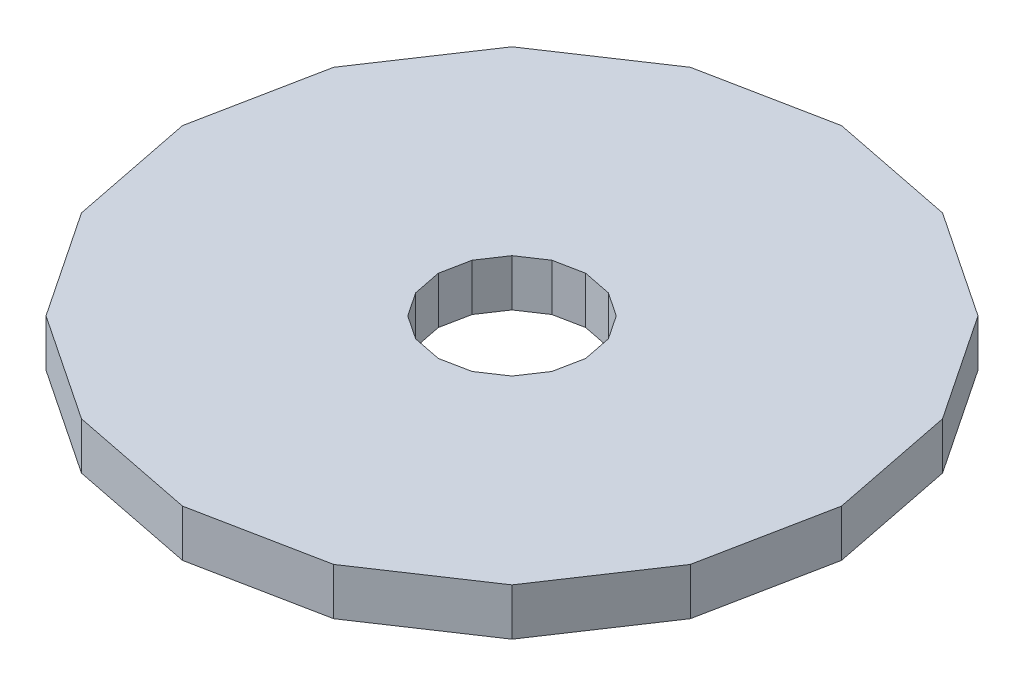
ISO-10303-21;
HEADER;
FILE_DESCRIPTION(('STEP AP214'),'2;1');
FILE_NAME('part.step','',(''),(''),'','','');
FILE_SCHEMA(('AUTOMOTIVE_DESIGN { 1 0 10303 214 1 1 1 1 }'));
ENDSEC;
DATA;
#1=APPLICATION_CONTEXT('core data for automotive mechanical design processes');
#2=APPLICATION_PROTOCOL_DEFINITION('international standard','automotive_design',2000,#1);
#3=PRODUCT_CONTEXT('',#1,'mechanical');
#4=PRODUCT('Part','Part','',(#3));
#5=PRODUCT_RELATED_PRODUCT_CATEGORY('part','',(#4));
#6=PRODUCT_DEFINITION_FORMATION('','',#4);
#7=PRODUCT_DEFINITION_CONTEXT('part definition',#1,'design');
#8=PRODUCT_DEFINITION('design','',#6,#7);
#9=PRODUCT_DEFINITION_SHAPE('','',#8);
#10=(LENGTH_UNIT() NAMED_UNIT(*) SI_UNIT(.MILLI.,.METRE.));
#11=(NAMED_UNIT(*) PLANE_ANGLE_UNIT() SI_UNIT($,.RADIAN.));
#12=(NAMED_UNIT(*) SI_UNIT($,.STERADIAN.) SOLID_ANGLE_UNIT());
#13=UNCERTAINTY_MEASURE_WITH_UNIT(LENGTH_MEASURE(1.E-05),#10,'distance_accuracy_value','');
#14=(GEOMETRIC_REPRESENTATION_CONTEXT(3) GLOBAL_UNCERTAINTY_ASSIGNED_CONTEXT((#13)) GLOBAL_UNIT_ASSIGNED_CONTEXT((#10,
#11,#12)) REPRESENTATION_CONTEXT('',''));
#15=CARTESIAN_POINT('',(0.,0.,0.));
#16=DIRECTION('',(0.,0.,1.));
#17=DIRECTION('',(1.,0.,0.));
#18=AXIS2_PLACEMENT_3D('',#15,#16,#17);
#19=CARTESIAN_POINT('',(0.,19.05,0.));
#20=DIRECTION('',(0.,1.,0.));
#21=DIRECTION('',(0.,0.,1.));
#22=AXIS2_PLACEMENT_3D('',#19,#20,#21);
#23=PLANE('',#22);
#24=DIRECTION('',(0.195090322016117,0.,-0.980785280403233));
#25=VECTOR('',#24,1.);
#26=CARTESIAN_POINT('',(123.292654296521,19.05,51.069489550595));
#27=LINE('',#26,#25);
#28=CARTESIAN_POINT('',(123.292654296521,19.05,51.069489550595));
#29=VERTEX_POINT('',#28);
#30=CARTESIAN_POINT('',(133.451007363901,19.05,-1.58553733568368E-12));
#31=VERTEX_POINT('',#30);
#32=EDGE_CURVE('E386',#29,#31,#27,.T.);
#33=ORIENTED_EDGE('',*,*,#32,.T.);
#34=DIRECTION('',(-0.19509032201614,0.,-0.980785280403228));
#35=VECTOR('',#34,1.);
#36=CARTESIAN_POINT('',(133.451007363901,19.05,-1.58553733568368E-12));
#37=LINE('',#36,#35);
#38=CARTESIAN_POINT('',(123.29265429652,19.05,-51.0694895505977));
#39=VERTEX_POINT('',#38);
#40=EDGE_CURVE('E390',#31,#39,#37,.T.);
#41=ORIENTED_EDGE('',*,*,#40,.T.);
#42=DIRECTION('',(-0.555570233019612,0.,-0.831469612302539));
#43=VECTOR('',#42,1.);
#44=CARTESIAN_POINT('',(123.29265429652,19.05,-51.0694895505977));
#45=LINE('',#44,#43);
#46=CARTESIAN_POINT('',(94.3641122631888,19.05,-94.3641122631911));
#47=VERTEX_POINT('',#46);
#48=EDGE_CURVE('E394',#39,#47,#45,.T.);
#49=ORIENTED_EDGE('',*,*,#48,.T.);
#50=DIRECTION('',(-0.831469612302552,0.,-0.555570233019593));
#51=VECTOR('',#50,1.);
#52=CARTESIAN_POINT('',(94.3641122631888,19.05,-94.3641122631911));
#53=LINE('',#52,#51);
#54=CARTESIAN_POINT('',(51.0694895505949,19.05,-123.292654296521));
#55=VERTEX_POINT('',#54);
#56=EDGE_CURVE('E396',#47,#55,#53,.T.);
#57=ORIENTED_EDGE('',*,*,#56,.T.);
#58=DIRECTION('',(-0.980785280403233,0.,-0.195090322016117));
#59=VECTOR('',#58,1.);
#60=CARTESIAN_POINT('',(51.0694895505949,19.05,-123.292654296521));
#61=LINE('',#60,#59);
#62=CARTESIAN_POINT('',(-1.58266796071834E-12,19.05,-133.451007363901));
#63=VERTEX_POINT('',#62);
#64=EDGE_CURVE('E399',#55,#63,#61,.T.);
#65=ORIENTED_EDGE('',*,*,#64,.T.);
#66=DIRECTION('',(-0.980785280403228,0.,0.195090322016139));
#67=VECTOR('',#66,1.);
#68=CARTESIAN_POINT('',(-1.58266796071834E-12,19.05,-133.451007363901));
#69=LINE('',#68,#67);
#70=CARTESIAN_POINT('',(-51.0694895505977,19.05,-123.29265429652));
#71=VERTEX_POINT('',#70);
#72=EDGE_CURVE('E401',#63,#71,#69,.T.);
#73=ORIENTED_EDGE('',*,*,#72,.T.);
#74=DIRECTION('',(-0.831469612302539,0.,0.555570233019612));
#75=VECTOR('',#74,1.);
#76=CARTESIAN_POINT('',(-51.0694895505977,19.05,-123.29265429652));
#77=LINE('',#76,#75);
#78=CARTESIAN_POINT('',(-94.364112263191,19.05,-94.3641122631889));
#79=VERTEX_POINT('',#78);
#80=EDGE_CURVE('E403',#71,#79,#77,.T.);
#81=ORIENTED_EDGE('',*,*,#80,.T.);
#82=DIRECTION('',(-0.555570233019593,0.,0.831469612302552));
#83=VECTOR('',#82,1.);
#84=CARTESIAN_POINT('',(-94.364112263191,19.05,-94.3641122631889));
#85=LINE('',#84,#83);
#86=CARTESIAN_POINT('',(-123.292654296521,19.05,-51.0694895505949));
#87=VERTEX_POINT('',#86);
#88=EDGE_CURVE('E405',#79,#87,#85,.T.);
#89=ORIENTED_EDGE('',*,*,#88,.T.);
#90=DIRECTION('',(-0.195090322016117,0.,0.980785280403233));
#91=VECTOR('',#90,1.);
#92=CARTESIAN_POINT('',(-123.292654296521,19.05,-51.0694895505949));
#93=LINE('',#92,#91);
#94=CARTESIAN_POINT('',(-133.451007363901,19.05,1.58263703031072E-12));
#95=VERTEX_POINT('',#94);
#96=EDGE_CURVE('E407',#87,#95,#93,.T.);
#97=ORIENTED_EDGE('',*,*,#96,.T.);
#98=DIRECTION('',(0.19509032201614,0.,0.980785280403228));
#99=VECTOR('',#98,1.);
#100=CARTESIAN_POINT('',(-133.451007363901,19.05,1.58263703031072E-12));
#101=LINE('',#100,#99);
#102=CARTESIAN_POINT('',(-123.29265429652,19.05,51.0694895505977));
#103=VERTEX_POINT('',#102);
#104=EDGE_CURVE('E410',#95,#103,#101,.T.);
#105=ORIENTED_EDGE('',*,*,#104,.T.);
#106=DIRECTION('',(0.555570233019612,0.,0.831469612302539));
#107=VECTOR('',#106,1.);
#108=CARTESIAN_POINT('',(-123.29265429652,19.05,51.0694895505977));
#109=LINE('',#108,#107);
#110=CARTESIAN_POINT('',(-94.3641122631889,19.05,94.3641122631911));
#111=VERTEX_POINT('',#110);
#112=EDGE_CURVE('E412',#103,#111,#109,.T.);
#113=ORIENTED_EDGE('',*,*,#112,.T.);
#114=DIRECTION('',(0.831469612302552,0.,0.555570233019593));
#115=VECTOR('',#114,1.);
#116=CARTESIAN_POINT('',(-94.3641122631889,19.05,94.3641122631911));
#117=LINE('',#116,#115);
#118=CARTESIAN_POINT('',(-51.0694895505949,19.05,123.292654296521));
#119=VERTEX_POINT('',#118);
#120=EDGE_CURVE('E414',#111,#119,#117,.T.);
#121=ORIENTED_EDGE('',*,*,#120,.T.);
#122=DIRECTION('',(0.980785280403233,0.,0.195090322016117));
#123=VECTOR('',#122,1.);
#124=CARTESIAN_POINT('',(-51.0694895505949,19.05,123.292654296521));
#125=LINE('',#124,#123);
#126=CARTESIAN_POINT('',(1.40174184642096E-12,19.05,133.451007363901));
#127=VERTEX_POINT('',#126);
#128=EDGE_CURVE('E416',#119,#127,#125,.T.);
#129=ORIENTED_EDGE('',*,*,#128,.T.);
#130=DIRECTION('',(0.980785280403228,0.,-0.19509032201614));
#131=VECTOR('',#130,1.);
#132=CARTESIAN_POINT('',(1.40174184642096E-12,19.05,133.451007363901));
#133=LINE('',#132,#131);
#134=CARTESIAN_POINT('',(51.0694895505977,19.05,123.29265429652));
#135=VERTEX_POINT('',#134);
#136=EDGE_CURVE('E418',#127,#135,#133,.T.);
#137=ORIENTED_EDGE('',*,*,#136,.T.);
#138=DIRECTION('',(0.831469612302539,0.,-0.555570233019612));
#139=VECTOR('',#138,1.);
#140=CARTESIAN_POINT('',(51.0694895505977,19.05,123.29265429652));
#141=LINE('',#140,#139);
#142=CARTESIAN_POINT('',(94.3641122631911,19.05,94.3641122631889));
#143=VERTEX_POINT('',#142);
#144=EDGE_CURVE('E421',#135,#143,#141,.T.);
#145=ORIENTED_EDGE('',*,*,#144,.T.);
#146=DIRECTION('',(0.555570233019593,0.,-0.831469612302552));
#147=VECTOR('',#146,1.);
#148=CARTESIAN_POINT('',(94.3641122631911,19.05,94.3641122631889));
#149=LINE('',#148,#147);
#150=EDGE_CURVE('E423',#143,#29,#149,.T.);
#151=ORIENTED_EDGE('',*,*,#150,.T.);
#152=EDGE_LOOP('',(#33,#41,#49,#57,#65,#73,#81,#89,#97,#105,#113,#121,#129,#137,#145,#151));
#153=FACE_BOUND('',#152,.T.);
#154=DIRECTION('',(-0.19509032201614,0.,-0.980785280403228));
#155=VECTOR('',#154,1.);
#156=CARTESIAN_POINT('',(29.8605456899354,19.05,-3.61150581910217E-13));
#157=LINE('',#156,#155);
#158=CARTESIAN_POINT('',(29.8605456899354,19.05,-3.61150581910217E-13));
#159=VERTEX_POINT('',#158);
#160=CARTESIAN_POINT('',(27.5875469925493,19.05,-11.4271361169194));
#161=VERTEX_POINT('',#160);
#162=EDGE_CURVE('E252',#159,#161,#157,.T.);
#163=ORIENTED_EDGE('',*,*,#162,.F.);
#164=DIRECTION('',(0.195090322016117,0.,-0.980785280403233));
#165=VECTOR('',#164,1.);
#166=CARTESIAN_POINT('',(27.5875469925496,19.05,11.4271361169188));
#167=LINE('',#166,#165);
#168=CARTESIAN_POINT('',(27.5875469925496,19.05,11.4271361169188));
#169=VERTEX_POINT('',#168);
#170=EDGE_CURVE('E243',#169,#159,#167,.T.);
#171=ORIENTED_EDGE('',*,*,#170,.F.);
#172=DIRECTION('',(0.555570233019593,0.,-0.831469612302552));
#173=VECTOR('',#172,1.);
#174=CARTESIAN_POINT('',(21.1145943472843,19.05,21.1145943472838));
#175=LINE('',#174,#173);
#176=CARTESIAN_POINT('',(21.1145943472843,19.05,21.1145943472838));
#177=VERTEX_POINT('',#176);
#178=EDGE_CURVE('E299',#177,#169,#175,.T.);
#179=ORIENTED_EDGE('',*,*,#178,.F.);
#180=DIRECTION('',(0.831469612302539,0.,-0.555570233019612));
#181=VECTOR('',#180,1.);
#182=CARTESIAN_POINT('',(11.4271361169194,19.05,27.5875469925493));
#183=LINE('',#182,#181);
#184=CARTESIAN_POINT('',(11.4271361169194,19.05,27.5875469925493));
#185=VERTEX_POINT('',#184);
#186=EDGE_CURVE('E296',#185,#177,#183,.T.);
#187=ORIENTED_EDGE('',*,*,#186,.F.);
#188=DIRECTION('',(0.980785280403228,0.,-0.19509032201614));
#189=VECTOR('',#188,1.);
#190=CARTESIAN_POINT('',(3.39465066593553E-13,19.05,29.8605456899354));
#191=LINE('',#190,#189);
#192=CARTESIAN_POINT('',(3.39465066593553E-13,19.05,29.8605456899354));
#193=VERTEX_POINT('',#192);
#194=EDGE_CURVE('E293',#193,#185,#191,.T.);
#195=ORIENTED_EDGE('',*,*,#194,.F.);
#196=DIRECTION('',(0.980785280403233,0.,0.195090322016117));
#197=VECTOR('',#196,1.);
#198=CARTESIAN_POINT('',(-11.4271361169187,19.05,27.5875469925496));
#199=LINE('',#198,#197);
#200=CARTESIAN_POINT('',(-11.4271361169187,19.05,27.5875469925496));
#201=VERTEX_POINT('',#200);
#202=EDGE_CURVE('E291',#201,#193,#199,.T.);
#203=ORIENTED_EDGE('',*,*,#202,.F.);
#204=DIRECTION('',(0.831469612302552,0.,0.555570233019593));
#205=VECTOR('',#204,1.);
#206=CARTESIAN_POINT('',(-21.1145943472838,19.05,21.1145943472843));
#207=LINE('',#206,#205);
#208=CARTESIAN_POINT('',(-21.1145943472838,19.05,21.1145943472843));
#209=VERTEX_POINT('',#208);
#210=EDGE_CURVE('E288',#209,#201,#207,.T.);
#211=ORIENTED_EDGE('',*,*,#210,.F.);
#212=DIRECTION('',(0.555570233019612,0.,0.831469612302539));
#213=VECTOR('',#212,1.);
#214=CARTESIAN_POINT('',(-27.5875469925493,19.05,11.4271361169193));
#215=LINE('',#214,#213);
#216=CARTESIAN_POINT('',(-27.5875469925493,19.05,11.4271361169193));
#217=VERTEX_POINT('',#216);
#218=EDGE_CURVE('E286',#217,#209,#215,.T.);
#219=ORIENTED_EDGE('',*,*,#218,.F.);
#220=DIRECTION('',(0.19509032201614,0.,0.980785280403228));
#221=VECTOR('',#220,1.);
#222=CARTESIAN_POINT('',(-29.8605456899354,19.05,3.81095473732525E-13));
#223=LINE('',#222,#221);
#224=CARTESIAN_POINT('',(-29.8605456899354,19.05,3.81095473732525E-13));
#225=VERTEX_POINT('',#224);
#226=EDGE_CURVE('E283',#225,#217,#223,.T.);
#227=ORIENTED_EDGE('',*,*,#226,.F.);
#228=DIRECTION('',(-0.195090322016117,0.,0.980785280403233));
#229=VECTOR('',#228,1.);
#230=CARTESIAN_POINT('',(-27.5875469925495,19.05,-11.4271361169188));
#231=LINE('',#230,#229);
#232=CARTESIAN_POINT('',(-27.5875469925495,19.05,-11.4271361169188));
#233=VERTEX_POINT('',#232);
#234=EDGE_CURVE('E281',#233,#225,#231,.T.);
#235=ORIENTED_EDGE('',*,*,#234,.F.);
#236=DIRECTION('',(-0.555570233019593,0.,0.831469612302551));
#237=VECTOR('',#236,1.);
#238=CARTESIAN_POINT('',(-21.1145943472843,19.05,-21.1145943472838));
#239=LINE('',#238,#237);
#240=CARTESIAN_POINT('',(-21.1145943472843,19.05,-21.1145943472838));
#241=VERTEX_POINT('',#240);
#242=EDGE_CURVE('E279',#241,#233,#239,.T.);
#243=ORIENTED_EDGE('',*,*,#242,.F.);
#244=DIRECTION('',(-0.831469612302539,0.,0.555570233019612));
#245=VECTOR('',#244,1.);
#246=CARTESIAN_POINT('',(-11.4271361169194,19.05,-27.5875469925493));
#247=LINE('',#246,#245);
#248=CARTESIAN_POINT('',(-11.4271361169194,19.05,-27.5875469925493));
#249=VERTEX_POINT('',#248);
#250=EDGE_CURVE('E276',#249,#241,#247,.T.);
#251=ORIENTED_EDGE('',*,*,#250,.F.);
#252=DIRECTION('',(-0.980785280403228,0.,0.19509032201614));
#253=VECTOR('',#252,1.);
#254=CARTESIAN_POINT('',(-3.46955043257175E-13,19.05,-29.8605456899354));
#255=LINE('',#254,#253);
#256=CARTESIAN_POINT('',(-3.46955043257175E-13,19.05,-29.8605456899354));
#257=VERTEX_POINT('',#256);
#258=EDGE_CURVE('E274',#257,#249,#255,.T.);
#259=ORIENTED_EDGE('',*,*,#258,.F.);
#260=DIRECTION('',(-0.980785280403233,0.,-0.195090322016117));
#261=VECTOR('',#260,1.);
#262=CARTESIAN_POINT('',(11.4271361169188,19.05,-27.5875469925495));
#263=LINE('',#262,#261);
#264=CARTESIAN_POINT('',(11.4271361169188,19.05,-27.5875469925495));
#265=VERTEX_POINT('',#264);
#266=EDGE_CURVE('E272',#265,#257,#263,.T.);
#267=ORIENTED_EDGE('',*,*,#266,.F.);
#268=DIRECTION('',(-0.831469612302552,0.,-0.555570233019592));
#269=VECTOR('',#268,1.);
#270=CARTESIAN_POINT('',(21.1145943472838,19.05,-21.1145943472843));
#271=LINE('',#270,#269);
#272=CARTESIAN_POINT('',(21.1145943472838,19.05,-21.1145943472843));
#273=VERTEX_POINT('',#272);
#274=EDGE_CURVE('E268',#273,#265,#271,.T.);
#275=ORIENTED_EDGE('',*,*,#274,.F.);
#276=DIRECTION('',(-0.555570233019612,0.,-0.831469612302539));
#277=VECTOR('',#276,1.);
#278=CARTESIAN_POINT('',(27.5875469925493,19.05,-11.4271361169194));
#279=LINE('',#278,#277);
#280=EDGE_CURVE('E266',#161,#273,#279,.T.);
#281=ORIENTED_EDGE('',*,*,#280,.F.);
#282=EDGE_LOOP('',(#163,#171,#179,#187,#195,#203,#211,#219,#227,#235,#243,#251,#259,#267,#275,#281));
#283=FACE_BOUND('',#282,.T.);
#284=ADVANCED_FACE('F34',(#153,#283),#23,.T.);
#285=CARTESIAN_POINT('',(0.,0.,0.));
#286=DIRECTION('',(0.,1.,0.));
#287=DIRECTION('',(0.,0.,1.));
#288=AXIS2_PLACEMENT_3D('',#285,#286,#287);
#289=PLANE('',#288);
#290=DIRECTION('',(0.195090322016117,0.,-0.980785280403233));
#291=VECTOR('',#290,1.);
#292=CARTESIAN_POINT('',(123.292654296521,0.,51.069489550595));
#293=LINE('',#292,#291);
#294=CARTESIAN_POINT('',(123.292654296521,0.,51.069489550595));
#295=VERTEX_POINT('',#294);
#296=CARTESIAN_POINT('',(133.451007363901,0.,-1.58553733568368E-12));
#297=VERTEX_POINT('',#296);
#298=EDGE_CURVE('E261',#295,#297,#293,.T.);
#299=ORIENTED_EDGE('',*,*,#298,.F.);
#300=DIRECTION('',(0.555570233019593,0.,-0.831469612302552));
#301=VECTOR('',#300,1.);
#302=CARTESIAN_POINT('',(94.3641122631911,0.,94.3641122631889));
#303=LINE('',#302,#301);
#304=CARTESIAN_POINT('',(94.3641122631911,0.,94.3641122631889));
#305=VERTEX_POINT('',#304);
#306=EDGE_CURVE('E391',#305,#295,#303,.T.);
#307=ORIENTED_EDGE('',*,*,#306,.F.);
#308=DIRECTION('',(0.831469612302539,0.,-0.555570233019612));
#309=VECTOR('',#308,1.);
#310=CARTESIAN_POINT('',(51.0694895505977,0.,123.29265429652));
#311=LINE('',#310,#309);
#312=CARTESIAN_POINT('',(51.0694895505977,0.,123.29265429652));
#313=VERTEX_POINT('',#312);
#314=EDGE_CURVE('E458',#313,#305,#311,.T.);
#315=ORIENTED_EDGE('',*,*,#314,.F.);
#316=DIRECTION('',(0.980785280403228,0.,-0.19509032201614));
#317=VECTOR('',#316,1.);
#318=CARTESIAN_POINT('',(1.40174184642096E-12,0.,133.451007363901));
#319=LINE('',#318,#317);
#320=CARTESIAN_POINT('',(1.40174184642096E-12,0.,133.451007363901));
#321=VERTEX_POINT('',#320);
#322=EDGE_CURVE('E456',#321,#313,#319,.T.);
#323=ORIENTED_EDGE('',*,*,#322,.F.);
#324=DIRECTION('',(0.980785280403233,0.,0.195090322016117));
#325=VECTOR('',#324,1.);
#326=CARTESIAN_POINT('',(-51.0694895505949,0.,123.292654296521));
#327=LINE('',#326,#325);
#328=CARTESIAN_POINT('',(-51.0694895505949,0.,123.292654296521));
#329=VERTEX_POINT('',#328);
#330=EDGE_CURVE('E453',#329,#321,#327,.T.);
#331=ORIENTED_EDGE('',*,*,#330,.F.);
#332=DIRECTION('',(0.831469612302552,0.,0.555570233019593));
#333=VECTOR('',#332,1.);
#334=CARTESIAN_POINT('',(-94.3641122631889,0.,94.3641122631911));
#335=LINE('',#334,#333);
#336=CARTESIAN_POINT('',(-94.3641122631889,0.,94.3641122631911));
#337=VERTEX_POINT('',#336);
#338=EDGE_CURVE('E450',#337,#329,#335,.T.);
#339=ORIENTED_EDGE('',*,*,#338,.F.);
#340=DIRECTION('',(0.555570233019612,0.,0.831469612302539));
#341=VECTOR('',#340,1.);
#342=CARTESIAN_POINT('',(-123.29265429652,0.,51.0694895505977));
#343=LINE('',#342,#341);
#344=CARTESIAN_POINT('',(-123.29265429652,0.,51.0694895505977));
#345=VERTEX_POINT('',#344);
#346=EDGE_CURVE('E448',#345,#337,#343,.T.);
#347=ORIENTED_EDGE('',*,*,#346,.F.);
#348=DIRECTION('',(0.19509032201614,0.,0.980785280403228));
#349=VECTOR('',#348,1.);
#350=CARTESIAN_POINT('',(-133.451007363901,0.,1.58263703031072E-12));
#351=LINE('',#350,#349);
#352=CARTESIAN_POINT('',(-133.451007363901,0.,1.58263703031072E-12));
#353=VERTEX_POINT('',#352);
#354=EDGE_CURVE('E446',#353,#345,#351,.T.);
#355=ORIENTED_EDGE('',*,*,#354,.F.);
#356=DIRECTION('',(-0.195090322016117,0.,0.980785280403233));
#357=VECTOR('',#356,1.);
#358=CARTESIAN_POINT('',(-123.292654296521,0.,-51.0694895505949));
#359=LINE('',#358,#357);
#360=CARTESIAN_POINT('',(-123.292654296521,0.,-51.0694895505949));
#361=VERTEX_POINT('',#360);
#362=EDGE_CURVE('E444',#361,#353,#359,.T.);
#363=ORIENTED_EDGE('',*,*,#362,.F.);
#364=DIRECTION('',(-0.555570233019593,0.,0.831469612302552));
#365=VECTOR('',#364,1.);
#366=CARTESIAN_POINT('',(-94.364112263191,0.,-94.3641122631889));
#367=LINE('',#366,#365);
#368=CARTESIAN_POINT('',(-94.364112263191,0.,-94.3641122631889));
#369=VERTEX_POINT('',#368);
#370=EDGE_CURVE('E442',#369,#361,#367,.T.);
#371=ORIENTED_EDGE('',*,*,#370,.F.);
#372=DIRECTION('',(-0.831469612302539,0.,0.555570233019612));
#373=VECTOR('',#372,1.);
#374=CARTESIAN_POINT('',(-51.0694895505977,0.,-123.29265429652));
#375=LINE('',#374,#373);
#376=CARTESIAN_POINT('',(-51.0694895505977,0.,-123.29265429652));
#377=VERTEX_POINT('',#376);
#378=EDGE_CURVE('E440',#377,#369,#375,.T.);
#379=ORIENTED_EDGE('',*,*,#378,.F.);
#380=DIRECTION('',(-0.980785280403228,0.,0.195090322016139));
#381=VECTOR('',#380,1.);
#382=CARTESIAN_POINT('',(-1.58266796071834E-12,0.,-133.451007363901));
#383=LINE('',#382,#381);
#384=CARTESIAN_POINT('',(-1.58266796071834E-12,0.,-133.451007363901));
#385=VERTEX_POINT('',#384);
#386=EDGE_CURVE('E438',#385,#377,#383,.T.);
#387=ORIENTED_EDGE('',*,*,#386,.F.);
#388=DIRECTION('',(-0.980785280403233,0.,-0.195090322016117));
#389=VECTOR('',#388,1.);
#390=CARTESIAN_POINT('',(51.0694895505949,0.,-123.292654296521));
#391=LINE('',#390,#389);
#392=CARTESIAN_POINT('',(51.0694895505949,0.,-123.292654296521));
#393=VERTEX_POINT('',#392);
#394=EDGE_CURVE('E436',#393,#385,#391,.T.);
#395=ORIENTED_EDGE('',*,*,#394,.F.);
#396=DIRECTION('',(-0.831469612302552,0.,-0.555570233019593));
#397=VECTOR('',#396,1.);
#398=CARTESIAN_POINT('',(94.3641122631888,0.,-94.3641122631911));
#399=LINE('',#398,#397);
#400=CARTESIAN_POINT('',(94.3641122631888,0.,-94.3641122631911));
#401=VERTEX_POINT('',#400);
#402=EDGE_CURVE('E434',#401,#393,#399,.T.);
#403=ORIENTED_EDGE('',*,*,#402,.F.);
#404=DIRECTION('',(-0.555570233019612,0.,-0.831469612302539));
#405=VECTOR('',#404,1.);
#406=CARTESIAN_POINT('',(123.29265429652,0.,-51.0694895505977));
#407=LINE('',#406,#405);
#408=CARTESIAN_POINT('',(123.29265429652,0.,-51.0694895505977));
#409=VERTEX_POINT('',#408);
#410=EDGE_CURVE('E432',#409,#401,#407,.T.);
#411=ORIENTED_EDGE('',*,*,#410,.F.);
#412=DIRECTION('',(-0.19509032201614,0.,-0.980785280403228));
#413=VECTOR('',#412,1.);
#414=CARTESIAN_POINT('',(133.451007363901,0.,-1.58553733568368E-12));
#415=LINE('',#414,#413);
#416=EDGE_CURVE('E429',#297,#409,#415,.T.);
#417=ORIENTED_EDGE('',*,*,#416,.F.);
#418=EDGE_LOOP('',(#299,#307,#315,#323,#331,#339,#347,#355,#363,#371,#379,#387,#395,#403,#411,#417));
#419=FACE_BOUND('',#418,.T.);
#420=DIRECTION('',(0.195090322016117,0.,-0.980785280403233));
#421=VECTOR('',#420,1.);
#422=CARTESIAN_POINT('',(27.5875469925496,0.,11.4271361169188));
#423=LINE('',#422,#421);
#424=CARTESIAN_POINT('',(27.5875469925496,0.,11.4271361169188));
#425=VERTEX_POINT('',#424);
#426=CARTESIAN_POINT('',(29.8605456899354,0.,-3.61150581910217E-13));
#427=VERTEX_POINT('',#426);
#428=EDGE_CURVE('E57',#425,#427,#423,.T.);
#429=ORIENTED_EDGE('',*,*,#428,.T.);
#430=DIRECTION('',(-0.19509032201614,0.,-0.980785280403228));
#431=VECTOR('',#430,1.);
#432=CARTESIAN_POINT('',(29.8605456899354,0.,-3.61150581910217E-13));
#433=LINE('',#432,#431);
#434=CARTESIAN_POINT('',(27.5875469925493,0.,-11.4271361169194));
#435=VERTEX_POINT('',#434);
#436=EDGE_CURVE('E259',#427,#435,#433,.T.);
#437=ORIENTED_EDGE('',*,*,#436,.T.);
#438=DIRECTION('',(-0.555570233019612,0.,-0.831469612302539));
#439=VECTOR('',#438,1.);
#440=CARTESIAN_POINT('',(27.5875469925493,0.,-11.4271361169194));
#441=LINE('',#440,#439);
#442=CARTESIAN_POINT('',(21.1145943472838,0.,-21.1145943472843));
#443=VERTEX_POINT('',#442);
#444=EDGE_CURVE('E304',#435,#443,#441,.T.);
#445=ORIENTED_EDGE('',*,*,#444,.T.);
#446=DIRECTION('',(-0.831469612302552,0.,-0.555570233019592));
#447=VECTOR('',#446,1.);
#448=CARTESIAN_POINT('',(21.1145943472838,0.,-21.1145943472843));
#449=LINE('',#448,#447);
#450=CARTESIAN_POINT('',(11.4271361169188,0.,-27.5875469925495));
#451=VERTEX_POINT('',#450);
#452=EDGE_CURVE('E308',#443,#451,#449,.T.);
#453=ORIENTED_EDGE('',*,*,#452,.T.);
#454=DIRECTION('',(-0.980785280403233,0.,-0.195090322016117));
#455=VECTOR('',#454,1.);
#456=CARTESIAN_POINT('',(11.4271361169188,0.,-27.5875469925495));
#457=LINE('',#456,#455);
#458=CARTESIAN_POINT('',(-3.46955043257175E-13,0.,-29.8605456899354));
#459=VERTEX_POINT('',#458);
#460=EDGE_CURVE('E311',#451,#459,#457,.T.);
#461=ORIENTED_EDGE('',*,*,#460,.T.);
#462=DIRECTION('',(-0.980785280403228,0.,0.19509032201614));
#463=VECTOR('',#462,1.);
#464=CARTESIAN_POINT('',(-3.46955043257175E-13,0.,-29.8605456899354));
#465=LINE('',#464,#463);
#466=CARTESIAN_POINT('',(-11.4271361169194,0.,-27.5875469925493));
#467=VERTEX_POINT('',#466);
#468=EDGE_CURVE('E314',#459,#467,#465,.T.);
#469=ORIENTED_EDGE('',*,*,#468,.T.);
#470=DIRECTION('',(-0.831469612302539,0.,0.555570233019612));
#471=VECTOR('',#470,1.);
#472=CARTESIAN_POINT('',(-11.4271361169194,0.,-27.5875469925493));
#473=LINE('',#472,#471);
#474=CARTESIAN_POINT('',(-21.1145943472843,0.,-21.1145943472838));
#475=VERTEX_POINT('',#474);
#476=EDGE_CURVE('E317',#467,#475,#473,.T.);
#477=ORIENTED_EDGE('',*,*,#476,.T.);
#478=DIRECTION('',(-0.555570233019593,0.,0.831469612302551));
#479=VECTOR('',#478,1.);
#480=CARTESIAN_POINT('',(-21.1145943472843,0.,-21.1145943472838));
#481=LINE('',#480,#479);
#482=CARTESIAN_POINT('',(-27.5875469925495,0.,-11.4271361169188));
#483=VERTEX_POINT('',#482);
#484=EDGE_CURVE('E321',#475,#483,#481,.T.);
#485=ORIENTED_EDGE('',*,*,#484,.T.);
#486=DIRECTION('',(-0.195090322016117,0.,0.980785280403233));
#487=VECTOR('',#486,1.);
#488=CARTESIAN_POINT('',(-27.5875469925495,0.,-11.4271361169188));
#489=LINE('',#488,#487);
#490=CARTESIAN_POINT('',(-29.8605456899354,0.,3.81095473732525E-13));
#491=VERTEX_POINT('',#490);
#492=EDGE_CURVE('E325',#483,#491,#489,.T.);
#493=ORIENTED_EDGE('',*,*,#492,.T.);
#494=DIRECTION('',(0.19509032201614,0.,0.980785280403228));
#495=VECTOR('',#494,1.);
#496=CARTESIAN_POINT('',(-29.8605456899354,0.,3.81095473732525E-13));
#497=LINE('',#496,#495);
#498=CARTESIAN_POINT('',(-27.5875469925493,0.,11.4271361169193));
#499=VERTEX_POINT('',#498);
#500=EDGE_CURVE('E329',#491,#499,#497,.T.);
#501=ORIENTED_EDGE('',*,*,#500,.T.);
#502=DIRECTION('',(0.555570233019612,0.,0.831469612302539));
#503=VECTOR('',#502,1.);
#504=CARTESIAN_POINT('',(-27.5875469925493,0.,11.4271361169193));
#505=LINE('',#504,#503);
#506=CARTESIAN_POINT('',(-21.1145943472838,0.,21.1145943472843));
#507=VERTEX_POINT('',#506);
#508=EDGE_CURVE('E332',#499,#507,#505,.T.);
#509=ORIENTED_EDGE('',*,*,#508,.T.);
#510=DIRECTION('',(0.831469612302552,0.,0.555570233019593));
#511=VECTOR('',#510,1.);
#512=CARTESIAN_POINT('',(-21.1145943472838,0.,21.1145943472843));
#513=LINE('',#512,#511);
#514=CARTESIAN_POINT('',(-11.4271361169187,0.,27.5875469925496));
#515=VERTEX_POINT('',#514);
#516=EDGE_CURVE('E335',#507,#515,#513,.T.);
#517=ORIENTED_EDGE('',*,*,#516,.T.);
#518=DIRECTION('',(0.980785280403233,0.,0.195090322016117));
#519=VECTOR('',#518,1.);
#520=CARTESIAN_POINT('',(-11.4271361169187,0.,27.5875469925496));
#521=LINE('',#520,#519);
#522=CARTESIAN_POINT('',(3.39465066593553E-13,0.,29.8605456899354));
#523=VERTEX_POINT('',#522);
#524=EDGE_CURVE('E339',#515,#523,#521,.T.);
#525=ORIENTED_EDGE('',*,*,#524,.T.);
#526=DIRECTION('',(0.980785280403228,0.,-0.19509032201614));
#527=VECTOR('',#526,1.);
#528=CARTESIAN_POINT('',(3.39465066593553E-13,0.,29.8605456899354));
#529=LINE('',#528,#527);
#530=CARTESIAN_POINT('',(11.4271361169194,0.,27.5875469925493));
#531=VERTEX_POINT('',#530);
#532=EDGE_CURVE('E343',#523,#531,#529,.T.);
#533=ORIENTED_EDGE('',*,*,#532,.T.);
#534=DIRECTION('',(0.831469612302539,0.,-0.555570233019612));
#535=VECTOR('',#534,1.);
#536=CARTESIAN_POINT('',(11.4271361169194,0.,27.5875469925493));
#537=LINE('',#536,#535);
#538=CARTESIAN_POINT('',(21.1145943472843,0.,21.1145943472838));
#539=VERTEX_POINT('',#538);
#540=EDGE_CURVE('E347',#531,#539,#537,.T.);
#541=ORIENTED_EDGE('',*,*,#540,.T.);
#542=DIRECTION('',(0.555570233019593,0.,-0.831469612302552));
#543=VECTOR('',#542,1.);
#544=CARTESIAN_POINT('',(21.1145943472843,0.,21.1145943472838));
#545=LINE('',#544,#543);
#546=EDGE_CURVE('E253',#539,#425,#545,.T.);
#547=ORIENTED_EDGE('',*,*,#546,.T.);
#548=EDGE_LOOP('',(#429,#437,#445,#453,#461,#469,#477,#485,#493,#501,#509,#517,#525,#533,#541,#547));
#549=FACE_BOUND('',#548,.T.);
#550=ADVANCED_FACE('F518',(#419,#549),#289,.F.);
#551=CARTESIAN_POINT('',(123.292654296521,19.05,51.069489550595));
#552=DIRECTION('',(-0.980785280403233,0.,-0.195090322016117));
#553=DIRECTION('',(-0.195090322016117,0.,0.980785280403233));
#554=AXIS2_PLACEMENT_3D('',#551,#552,#553);
#555=PLANE('',#554);
#556=ORIENTED_EDGE('',*,*,#298,.T.);
#557=DIRECTION('',(0.,-1.,0.));
#558=VECTOR('',#557,1.);
#559=CARTESIAN_POINT('',(133.451007363901,19.05,-1.58553733568368E-12));
#560=LINE('',#559,#558);
#561=EDGE_CURVE('E11',#31,#297,#560,.T.);
#562=ORIENTED_EDGE('',*,*,#561,.F.);
#563=ORIENTED_EDGE('',*,*,#32,.F.);
#564=DIRECTION('',(0.,-1.,0.));
#565=VECTOR('',#564,1.);
#566=CARTESIAN_POINT('',(123.292654296521,19.05,51.069489550595));
#567=LINE('',#566,#565);
#568=EDGE_CURVE('E425',#29,#295,#567,.T.);
#569=ORIENTED_EDGE('',*,*,#568,.T.);
#570=EDGE_LOOP('',(#556,#562,#563,#569));
#571=FACE_BOUND('',#570,.T.);
#572=ADVANCED_FACE('F36',(#571),#555,.F.);
#573=CARTESIAN_POINT('',(133.451007363901,19.05,-1.58553733568368E-12));
#574=DIRECTION('',(-0.980785280403228,0.,0.19509032201614));
#575=DIRECTION('',(0.19509032201614,0.,0.980785280403228));
#576=AXIS2_PLACEMENT_3D('',#573,#574,#575);
#577=PLANE('',#576);
#578=ORIENTED_EDGE('',*,*,#416,.T.);
#579=DIRECTION('',(0.,-1.,0.));
#580=VECTOR('',#579,1.);
#581=CARTESIAN_POINT('',(123.29265429652,19.05,-51.0694895505977));
#582=LINE('',#581,#580);
#583=EDGE_CURVE('E42',#39,#409,#582,.T.);
#584=ORIENTED_EDGE('',*,*,#583,.F.);
#585=ORIENTED_EDGE('',*,*,#40,.F.);
#586=ORIENTED_EDGE('',*,*,#561,.T.);
#587=EDGE_LOOP('',(#578,#584,#585,#586));
#588=FACE_BOUND('',#587,.T.);
#589=ADVANCED_FACE('F535',(#588),#577,.F.);
#590=CARTESIAN_POINT('',(123.29265429652,19.05,-51.0694895505977));
#591=DIRECTION('',(-0.831469612302539,0.,0.555570233019612));
#592=DIRECTION('',(0.555570233019612,0.,0.831469612302539));
#593=AXIS2_PLACEMENT_3D('',#590,#591,#592);
#594=PLANE('',#593);
#595=ORIENTED_EDGE('',*,*,#410,.T.);
#596=DIRECTION('',(0.,-1.,0.));
#597=VECTOR('',#596,1.);
#598=CARTESIAN_POINT('',(94.3641122631888,19.05,-94.3641122631911));
#599=LINE('',#598,#597);
#600=EDGE_CURVE('E504',#47,#401,#599,.T.);
#601=ORIENTED_EDGE('',*,*,#600,.F.);
#602=ORIENTED_EDGE('',*,*,#48,.F.);
#603=ORIENTED_EDGE('',*,*,#583,.T.);
#604=EDGE_LOOP('',(#595,#601,#602,#603));
#605=FACE_BOUND('',#604,.T.);
#606=ADVANCED_FACE('F512',(#605),#594,.F.);
#607=CARTESIAN_POINT('',(94.3641122631888,19.05,-94.3641122631911));
#608=DIRECTION('',(-0.555570233019592,0.,0.831469612302552));
#609=DIRECTION('',(0.831469612302552,0.,0.555570233019593));
#610=AXIS2_PLACEMENT_3D('',#607,#608,#609);
#611=PLANE('',#610);
#612=ORIENTED_EDGE('',*,*,#402,.T.);
#613=DIRECTION('',(0.,-1.,0.));
#614=VECTOR('',#613,1.);
#615=CARTESIAN_POINT('',(51.0694895505949,19.05,-123.292654296521));
#616=LINE('',#615,#614);
#617=EDGE_CURVE('E500',#55,#393,#616,.T.);
#618=ORIENTED_EDGE('',*,*,#617,.F.);
#619=ORIENTED_EDGE('',*,*,#56,.F.);
#620=ORIENTED_EDGE('',*,*,#600,.T.);
#621=EDGE_LOOP('',(#612,#618,#619,#620));
#622=FACE_BOUND('',#621,.T.);
#623=ADVANCED_FACE('F524',(#622),#611,.F.);
#624=CARTESIAN_POINT('',(51.0694895505949,19.05,-123.292654296521));
#625=DIRECTION('',(-0.195090322016117,0.,0.980785280403233));
#626=DIRECTION('',(0.980785280403233,0.,0.195090322016117));
#627=AXIS2_PLACEMENT_3D('',#624,#625,#626);
#628=PLANE('',#627);
#629=ORIENTED_EDGE('',*,*,#394,.T.);
#630=DIRECTION('',(0.,-1.,0.));
#631=VECTOR('',#630,1.);
#632=CARTESIAN_POINT('',(-1.58266796071834E-12,19.05,-133.451007363901));
#633=LINE('',#632,#631);
#634=EDGE_CURVE('E497',#63,#385,#633,.T.);
#635=ORIENTED_EDGE('',*,*,#634,.F.);
#636=ORIENTED_EDGE('',*,*,#64,.F.);
#637=ORIENTED_EDGE('',*,*,#617,.T.);
#638=EDGE_LOOP('',(#629,#635,#636,#637));
#639=FACE_BOUND('',#638,.T.);
#640=ADVANCED_FACE('F528',(#639),#628,.F.);
#641=CARTESIAN_POINT('',(-1.58266796071834E-12,19.05,-133.451007363901));
#642=DIRECTION('',(0.195090322016139,0.,0.980785280403228));
#643=DIRECTION('',(0.980785280403228,0.,-0.195090322016139));
#644=AXIS2_PLACEMENT_3D('',#641,#642,#643);
#645=PLANE('',#644);
#646=ORIENTED_EDGE('',*,*,#386,.T.);
#647=DIRECTION('',(0.,-1.,0.));
#648=VECTOR('',#647,1.);
#649=CARTESIAN_POINT('',(-51.0694895505977,19.05,-123.29265429652));
#650=LINE('',#649,#648);
#651=EDGE_CURVE('E494',#71,#377,#650,.T.);
#652=ORIENTED_EDGE('',*,*,#651,.F.);
#653=ORIENTED_EDGE('',*,*,#72,.F.);
#654=ORIENTED_EDGE('',*,*,#634,.T.);
#655=EDGE_LOOP('',(#646,#652,#653,#654));
#656=FACE_BOUND('',#655,.T.);
#657=ADVANCED_FACE('F588',(#656),#645,.F.);
#658=CARTESIAN_POINT('',(-51.0694895505977,19.05,-123.29265429652));
#659=DIRECTION('',(0.555570233019612,0.,0.831469612302539));
#660=DIRECTION('',(0.831469612302539,0.,-0.555570233019612));
#661=AXIS2_PLACEMENT_3D('',#658,#659,#660);
#662=PLANE('',#661);
#663=ORIENTED_EDGE('',*,*,#378,.T.);
#664=DIRECTION('',(0.,-1.,0.));
#665=VECTOR('',#664,1.);
#666=CARTESIAN_POINT('',(-94.364112263191,19.05,-94.3641122631889));
#667=LINE('',#666,#665);
#668=EDGE_CURVE('E491',#79,#369,#667,.T.);
#669=ORIENTED_EDGE('',*,*,#668,.F.);
#670=ORIENTED_EDGE('',*,*,#80,.F.);
#671=ORIENTED_EDGE('',*,*,#651,.T.);
#672=EDGE_LOOP('',(#663,#669,#670,#671));
#673=FACE_BOUND('',#672,.T.);
#674=ADVANCED_FACE('F585',(#673),#662,.F.);
#675=CARTESIAN_POINT('',(-94.364112263191,19.05,-94.3641122631889));
#676=DIRECTION('',(0.831469612302552,0.,0.555570233019593));
#677=DIRECTION('',(0.555570233019593,0.,-0.831469612302552));
#678=AXIS2_PLACEMENT_3D('',#675,#676,#677);
#679=PLANE('',#678);
#680=ORIENTED_EDGE('',*,*,#370,.T.);
#681=DIRECTION('',(0.,-1.,0.));
#682=VECTOR('',#681,1.);
#683=CARTESIAN_POINT('',(-123.292654296521,19.05,-51.0694895505949));
#684=LINE('',#683,#682);
#685=EDGE_CURVE('E488',#87,#361,#684,.T.);
#686=ORIENTED_EDGE('',*,*,#685,.F.);
#687=ORIENTED_EDGE('',*,*,#88,.F.);
#688=ORIENTED_EDGE('',*,*,#668,.T.);
#689=EDGE_LOOP('',(#680,#686,#687,#688));
#690=FACE_BOUND('',#689,.T.);
#691=ADVANCED_FACE('F581',(#690),#679,.F.);
#692=CARTESIAN_POINT('',(-123.292654296521,19.05,-51.0694895505949));
#693=DIRECTION('',(0.980785280403233,0.,0.195090322016117));
#694=DIRECTION('',(0.195090322016117,0.,-0.980785280403233));
#695=AXIS2_PLACEMENT_3D('',#692,#693,#694);
#696=PLANE('',#695);
#697=ORIENTED_EDGE('',*,*,#362,.T.);
#698=DIRECTION('',(0.,-1.,0.));
#699=VECTOR('',#698,1.);
#700=CARTESIAN_POINT('',(-133.451007363901,19.05,1.58263703031072E-12));
#701=LINE('',#700,#699);
#702=EDGE_CURVE('E485',#95,#353,#701,.T.);
#703=ORIENTED_EDGE('',*,*,#702,.F.);
#704=ORIENTED_EDGE('',*,*,#96,.F.);
#705=ORIENTED_EDGE('',*,*,#685,.T.);
#706=EDGE_LOOP('',(#697,#703,#704,#705));
#707=FACE_BOUND('',#706,.T.);
#708=ADVANCED_FACE('F577',(#707),#696,.F.);
#709=CARTESIAN_POINT('',(-133.451007363901,19.05,1.58263703031072E-12));
#710=DIRECTION('',(0.980785280403228,0.,-0.19509032201614));
#711=DIRECTION('',(-0.19509032201614,0.,-0.980785280403228));
#712=AXIS2_PLACEMENT_3D('',#709,#710,#711);
#713=PLANE('',#712);
#714=ORIENTED_EDGE('',*,*,#354,.T.);
#715=DIRECTION('',(0.,-1.,0.));
#716=VECTOR('',#715,1.);
#717=CARTESIAN_POINT('',(-123.29265429652,19.05,51.0694895505977));
#718=LINE('',#717,#716);
#719=EDGE_CURVE('E482',#103,#345,#718,.T.);
#720=ORIENTED_EDGE('',*,*,#719,.F.);
#721=ORIENTED_EDGE('',*,*,#104,.F.);
#722=ORIENTED_EDGE('',*,*,#702,.T.);
#723=EDGE_LOOP('',(#714,#720,#721,#722));
#724=FACE_BOUND('',#723,.T.);
#725=ADVANCED_FACE('F572',(#724),#713,.F.);
#726=CARTESIAN_POINT('',(-123.29265429652,19.05,51.0694895505977));
#727=DIRECTION('',(0.831469612302539,0.,-0.555570233019612));
#728=DIRECTION('',(-0.555570233019612,0.,-0.831469612302539));
#729=AXIS2_PLACEMENT_3D('',#726,#727,#728);
#730=PLANE('',#729);
#731=ORIENTED_EDGE('',*,*,#346,.T.);
#732=DIRECTION('',(0.,-1.,0.));
#733=VECTOR('',#732,1.);
#734=CARTESIAN_POINT('',(-94.3641122631889,19.05,94.3641122631911));
#735=LINE('',#734,#733);
#736=EDGE_CURVE('E478',#111,#337,#735,.T.);
#737=ORIENTED_EDGE('',*,*,#736,.F.);
#738=ORIENTED_EDGE('',*,*,#112,.F.);
#739=ORIENTED_EDGE('',*,*,#719,.T.);
#740=EDGE_LOOP('',(#731,#737,#738,#739));
#741=FACE_BOUND('',#740,.T.);
#742=ADVANCED_FACE('F566',(#741),#730,.F.);
#743=CARTESIAN_POINT('',(-94.3641122631889,19.05,94.3641122631911));
#744=DIRECTION('',(0.555570233019593,0.,-0.831469612302552));
#745=DIRECTION('',(-0.831469612302552,0.,-0.555570233019593));
#746=AXIS2_PLACEMENT_3D('',#743,#744,#745);
#747=PLANE('',#746);
#748=ORIENTED_EDGE('',*,*,#338,.T.);
#749=DIRECTION('',(0.,-1.,0.));
#750=VECTOR('',#749,1.);
#751=CARTESIAN_POINT('',(-51.0694895505949,19.05,123.292654296521));
#752=LINE('',#751,#750);
#753=EDGE_CURVE('E474',#119,#329,#752,.T.);
#754=ORIENTED_EDGE('',*,*,#753,.F.);
#755=ORIENTED_EDGE('',*,*,#120,.F.);
#756=ORIENTED_EDGE('',*,*,#736,.T.);
#757=EDGE_LOOP('',(#748,#754,#755,#756));
#758=FACE_BOUND('',#757,.T.);
#759=ADVANCED_FACE('F562',(#758),#747,.F.);
#760=CARTESIAN_POINT('',(-51.0694895505949,19.05,123.292654296521));
#761=DIRECTION('',(0.195090322016117,0.,-0.980785280403233));
#762=DIRECTION('',(-0.980785280403233,0.,-0.195090322016117));
#763=AXIS2_PLACEMENT_3D('',#760,#761,#762);
#764=PLANE('',#763);
#765=ORIENTED_EDGE('',*,*,#330,.T.);
#766=DIRECTION('',(0.,-1.,0.));
#767=VECTOR('',#766,1.);
#768=CARTESIAN_POINT('',(1.40174184642096E-12,19.05,133.451007363901));
#769=LINE('',#768,#767);
#770=EDGE_CURVE('E470',#127,#321,#769,.T.);
#771=ORIENTED_EDGE('',*,*,#770,.F.);
#772=ORIENTED_EDGE('',*,*,#128,.F.);
#773=ORIENTED_EDGE('',*,*,#753,.T.);
#774=EDGE_LOOP('',(#765,#771,#772,#773));
#775=FACE_BOUND('',#774,.T.);
#776=ADVANCED_FACE('F557',(#775),#764,.F.);
#777=CARTESIAN_POINT('',(1.40174184642096E-12,19.05,133.451007363901));
#778=DIRECTION('',(-0.19509032201614,0.,-0.980785280403228));
#779=DIRECTION('',(-0.980785280403228,0.,0.19509032201614));
#780=AXIS2_PLACEMENT_3D('',#777,#778,#779);
#781=PLANE('',#780);
#782=ORIENTED_EDGE('',*,*,#322,.T.);
#783=DIRECTION('',(0.,-1.,0.));
#784=VECTOR('',#783,1.);
#785=CARTESIAN_POINT('',(51.0694895505977,19.05,123.29265429652));
#786=LINE('',#785,#784);
#787=EDGE_CURVE('E466',#135,#313,#786,.T.);
#788=ORIENTED_EDGE('',*,*,#787,.F.);
#789=ORIENTED_EDGE('',*,*,#136,.F.);
#790=ORIENTED_EDGE('',*,*,#770,.T.);
#791=EDGE_LOOP('',(#782,#788,#789,#790));
#792=FACE_BOUND('',#791,.T.);
#793=ADVANCED_FACE('F551',(#792),#781,.F.);
#794=CARTESIAN_POINT('',(51.0694895505977,19.05,123.29265429652));
#795=DIRECTION('',(-0.555570233019612,0.,-0.831469612302539));
#796=DIRECTION('',(-0.831469612302539,0.,0.555570233019612));
#797=AXIS2_PLACEMENT_3D('',#794,#795,#796);
#798=PLANE('',#797);
#799=ORIENTED_EDGE('',*,*,#314,.T.);
#800=DIRECTION('',(0.,-1.,0.));
#801=VECTOR('',#800,1.);
#802=CARTESIAN_POINT('',(94.3641122631911,19.05,94.3641122631889));
#803=LINE('',#802,#801);
#804=EDGE_CURVE('E463',#143,#305,#803,.T.);
#805=ORIENTED_EDGE('',*,*,#804,.F.);
#806=ORIENTED_EDGE('',*,*,#144,.F.);
#807=ORIENTED_EDGE('',*,*,#787,.T.);
#808=EDGE_LOOP('',(#799,#805,#806,#807));
#809=FACE_BOUND('',#808,.T.);
#810=ADVANCED_FACE('F547',(#809),#798,.F.);
#811=CARTESIAN_POINT('',(94.3641122631911,19.05,94.3641122631889));
#812=DIRECTION('',(-0.831469612302552,0.,-0.555570233019593));
#813=DIRECTION('',(-0.555570233019593,0.,0.831469612302552));
#814=AXIS2_PLACEMENT_3D('',#811,#812,#813);
#815=PLANE('',#814);
#816=ORIENTED_EDGE('',*,*,#306,.T.);
#817=ORIENTED_EDGE('',*,*,#568,.F.);
#818=ORIENTED_EDGE('',*,*,#150,.F.);
#819=ORIENTED_EDGE('',*,*,#804,.T.);
#820=EDGE_LOOP('',(#816,#817,#818,#819));
#821=FACE_BOUND('',#820,.T.);
#822=ADVANCED_FACE('F542',(#821),#815,.F.);
#823=CARTESIAN_POINT('',(27.5875469925496,19.05,11.4271361169188));
#824=DIRECTION('',(-0.980785280403233,0.,-0.195090322016117));
#825=DIRECTION('',(-0.195090322016117,0.,0.980785280403233));
#826=AXIS2_PLACEMENT_3D('',#823,#824,#825);
#827=PLANE('',#826);
#828=ORIENTED_EDGE('',*,*,#428,.F.);
#829=DIRECTION('',(0.,-1.,0.));
#830=VECTOR('',#829,1.);
#831=CARTESIAN_POINT('',(27.5875469925496,19.05,11.4271361169188));
#832=LINE('',#831,#830);
#833=EDGE_CURVE('E247',#169,#425,#832,.T.);
#834=ORIENTED_EDGE('',*,*,#833,.F.);
#835=ORIENTED_EDGE('',*,*,#170,.T.);
#836=DIRECTION('',(0.,-1.,0.));
#837=VECTOR('',#836,1.);
#838=CARTESIAN_POINT('',(29.8605456899354,19.05,-3.61150581910217E-13));
#839=LINE('',#838,#837);
#840=EDGE_CURVE('E246',#159,#427,#839,.T.);
#841=ORIENTED_EDGE('',*,*,#840,.T.);
#842=EDGE_LOOP('',(#828,#834,#835,#841));
#843=FACE_BOUND('',#842,.T.);
#844=ADVANCED_FACE('F245',(#843),#827,.T.);
#845=CARTESIAN_POINT('',(29.8605456899354,19.05,-3.61150581910217E-13));
#846=DIRECTION('',(-0.980785280403228,0.,0.19509032201614));
#847=DIRECTION('',(0.19509032201614,0.,0.980785280403228));
#848=AXIS2_PLACEMENT_3D('',#845,#846,#847);
#849=PLANE('',#848);
#850=ORIENTED_EDGE('',*,*,#436,.F.);
#851=ORIENTED_EDGE('',*,*,#840,.F.);
#852=ORIENTED_EDGE('',*,*,#162,.T.);
#853=DIRECTION('',(0.,-1.,0.));
#854=VECTOR('',#853,1.);
#855=CARTESIAN_POINT('',(27.5875469925493,19.05,-11.4271361169194));
#856=LINE('',#855,#854);
#857=EDGE_CURVE('E262',#161,#435,#856,.T.);
#858=ORIENTED_EDGE('',*,*,#857,.T.);
#859=EDGE_LOOP('',(#850,#851,#852,#858));
#860=FACE_BOUND('',#859,.T.);
#861=ADVANCED_FACE('F256',(#860),#849,.T.);
#862=CARTESIAN_POINT('',(27.5875469925493,19.05,-11.4271361169194));
#863=DIRECTION('',(-0.831469612302539,0.,0.555570233019612));
#864=DIRECTION('',(0.555570233019612,0.,0.831469612302539));
#865=AXIS2_PLACEMENT_3D('',#862,#863,#864);
#866=PLANE('',#865);
#867=ORIENTED_EDGE('',*,*,#444,.F.);
#868=ORIENTED_EDGE('',*,*,#857,.F.);
#869=ORIENTED_EDGE('',*,*,#280,.T.);
#870=DIRECTION('',(0.,-1.,0.));
#871=VECTOR('',#870,1.);
#872=CARTESIAN_POINT('',(21.1145943472838,19.05,-21.1145943472843));
#873=LINE('',#872,#871);
#874=EDGE_CURVE('E382',#273,#443,#873,.T.);
#875=ORIENTED_EDGE('',*,*,#874,.T.);
#876=EDGE_LOOP('',(#867,#868,#869,#875));
#877=FACE_BOUND('',#876,.T.);
#878=ADVANCED_FACE('F670',(#877),#866,.T.);
#879=CARTESIAN_POINT('',(21.1145943472838,19.05,-21.1145943472843));
#880=DIRECTION('',(-0.555570233019592,0.,0.831469612302552));
#881=DIRECTION('',(0.831469612302552,0.,0.555570233019592));
#882=AXIS2_PLACEMENT_3D('',#879,#880,#881);
#883=PLANE('',#882);
#884=ORIENTED_EDGE('',*,*,#452,.F.);
#885=ORIENTED_EDGE('',*,*,#874,.F.);
#886=ORIENTED_EDGE('',*,*,#274,.T.);
#887=DIRECTION('',(0.,-1.,0.));
#888=VECTOR('',#887,1.);
#889=CARTESIAN_POINT('',(11.4271361169188,19.05,-27.5875469925495));
#890=LINE('',#889,#888);
#891=EDGE_CURVE('E380',#265,#451,#890,.T.);
#892=ORIENTED_EDGE('',*,*,#891,.T.);
#893=EDGE_LOOP('',(#884,#885,#886,#892));
#894=FACE_BOUND('',#893,.T.);
#895=ADVANCED_FACE('F676',(#894),#883,.T.);
#896=CARTESIAN_POINT('',(11.4271361169188,19.05,-27.5875469925495));
#897=DIRECTION('',(-0.195090322016117,0.,0.980785280403233));
#898=DIRECTION('',(0.980785280403233,0.,0.195090322016117));
#899=AXIS2_PLACEMENT_3D('',#896,#897,#898);
#900=PLANE('',#899);
#901=ORIENTED_EDGE('',*,*,#460,.F.);
#902=ORIENTED_EDGE('',*,*,#891,.F.);
#903=ORIENTED_EDGE('',*,*,#266,.T.);
#904=DIRECTION('',(0.,-1.,0.));
#905=VECTOR('',#904,1.);
#906=CARTESIAN_POINT('',(-3.46955043257175E-13,19.05,-29.8605456899354));
#907=LINE('',#906,#905);
#908=EDGE_CURVE('E378',#257,#459,#907,.T.);
#909=ORIENTED_EDGE('',*,*,#908,.T.);
#910=EDGE_LOOP('',(#901,#902,#903,#909));
#911=FACE_BOUND('',#910,.T.);
#912=ADVANCED_FACE('F684',(#911),#900,.T.);
#913=CARTESIAN_POINT('',(-3.46955043257175E-13,19.05,-29.8605456899354));
#914=DIRECTION('',(0.19509032201614,0.,0.980785280403228));
#915=DIRECTION('',(0.980785280403228,0.,-0.19509032201614));
#916=AXIS2_PLACEMENT_3D('',#913,#914,#915);
#917=PLANE('',#916);
#918=ORIENTED_EDGE('',*,*,#468,.F.);
#919=ORIENTED_EDGE('',*,*,#908,.F.);
#920=ORIENTED_EDGE('',*,*,#258,.T.);
#921=DIRECTION('',(0.,-1.,0.));
#922=VECTOR('',#921,1.);
#923=CARTESIAN_POINT('',(-11.4271361169194,19.05,-27.5875469925493));
#924=LINE('',#923,#922);
#925=EDGE_CURVE('E376',#249,#467,#924,.T.);
#926=ORIENTED_EDGE('',*,*,#925,.T.);
#927=EDGE_LOOP('',(#918,#919,#920,#926));
#928=FACE_BOUND('',#927,.T.);
#929=ADVANCED_FACE('F692',(#928),#917,.T.);
#930=CARTESIAN_POINT('',(-11.4271361169194,19.05,-27.5875469925493));
#931=DIRECTION('',(0.555570233019612,0.,0.831469612302538));
#932=DIRECTION('',(0.831469612302539,0.,-0.555570233019612));
#933=AXIS2_PLACEMENT_3D('',#930,#931,#932);
#934=PLANE('',#933);
#935=ORIENTED_EDGE('',*,*,#476,.F.);
#936=ORIENTED_EDGE('',*,*,#925,.F.);
#937=ORIENTED_EDGE('',*,*,#250,.T.);
#938=DIRECTION('',(0.,-1.,0.));
#939=VECTOR('',#938,1.);
#940=CARTESIAN_POINT('',(-21.1145943472843,19.05,-21.1145943472838));
#941=LINE('',#940,#939);
#942=EDGE_CURVE('E374',#241,#475,#941,.T.);
#943=ORIENTED_EDGE('',*,*,#942,.T.);
#944=EDGE_LOOP('',(#935,#936,#937,#943));
#945=FACE_BOUND('',#944,.T.);
#946=ADVANCED_FACE('F700',(#945),#934,.T.);
#947=CARTESIAN_POINT('',(-21.1145943472843,19.05,-21.1145943472838));
#948=DIRECTION('',(0.831469612302551,0.,0.555570233019593));
#949=DIRECTION('',(0.555570233019593,0.,-0.831469612302551));
#950=AXIS2_PLACEMENT_3D('',#947,#948,#949);
#951=PLANE('',#950);
#952=ORIENTED_EDGE('',*,*,#484,.F.);
#953=ORIENTED_EDGE('',*,*,#942,.F.);
#954=ORIENTED_EDGE('',*,*,#242,.T.);
#955=DIRECTION('',(0.,-1.,0.));
#956=VECTOR('',#955,1.);
#957=CARTESIAN_POINT('',(-27.5875469925495,19.05,-11.4271361169188));
#958=LINE('',#957,#956);
#959=EDGE_CURVE('E371',#233,#483,#958,.T.);
#960=ORIENTED_EDGE('',*,*,#959,.T.);
#961=EDGE_LOOP('',(#952,#953,#954,#960));
#962=FACE_BOUND('',#961,.T.);
#963=ADVANCED_FACE('F709',(#962),#951,.T.);
#964=CARTESIAN_POINT('',(-27.5875469925495,19.05,-11.4271361169188));
#965=DIRECTION('',(0.980785280403233,0.,0.195090322016117));
#966=DIRECTION('',(0.195090322016117,0.,-0.980785280403233));
#967=AXIS2_PLACEMENT_3D('',#964,#965,#966);
#968=PLANE('',#967);
#969=ORIENTED_EDGE('',*,*,#492,.F.);
#970=ORIENTED_EDGE('',*,*,#959,.F.);
#971=ORIENTED_EDGE('',*,*,#234,.T.);
#972=DIRECTION('',(0.,-1.,0.));
#973=VECTOR('',#972,1.);
#974=CARTESIAN_POINT('',(-29.8605456899354,19.05,3.81095473732525E-13));
#975=LINE('',#974,#973);
#976=EDGE_CURVE('E368',#225,#491,#975,.T.);
#977=ORIENTED_EDGE('',*,*,#976,.T.);
#978=EDGE_LOOP('',(#969,#970,#971,#977));
#979=FACE_BOUND('',#978,.T.);
#980=ADVANCED_FACE('F716',(#979),#968,.T.);
#981=CARTESIAN_POINT('',(-29.8605456899354,19.05,3.81095473732525E-13));
#982=DIRECTION('',(0.980785280403228,0.,-0.19509032201614));
#983=DIRECTION('',(-0.19509032201614,0.,-0.980785280403228));
#984=AXIS2_PLACEMENT_3D('',#981,#982,#983);
#985=PLANE('',#984);
#986=ORIENTED_EDGE('',*,*,#500,.F.);
#987=ORIENTED_EDGE('',*,*,#976,.F.);
#988=ORIENTED_EDGE('',*,*,#226,.T.);
#989=DIRECTION('',(0.,-1.,0.));
#990=VECTOR('',#989,1.);
#991=CARTESIAN_POINT('',(-27.5875469925493,19.05,11.4271361169193));
#992=LINE('',#991,#990);
#993=EDGE_CURVE('E365',#217,#499,#992,.T.);
#994=ORIENTED_EDGE('',*,*,#993,.T.);
#995=EDGE_LOOP('',(#986,#987,#988,#994));
#996=FACE_BOUND('',#995,.T.);
#997=ADVANCED_FACE('F724',(#996),#985,.T.);
#998=CARTESIAN_POINT('',(-27.5875469925493,19.05,11.4271361169193));
#999=DIRECTION('',(0.831469612302539,0.,-0.555570233019612));
#1000=DIRECTION('',(-0.555570233019612,0.,-0.831469612302539));
#1001=AXIS2_PLACEMENT_3D('',#998,#999,#1000);
#1002=PLANE('',#1001);
#1003=ORIENTED_EDGE('',*,*,#508,.F.);
#1004=ORIENTED_EDGE('',*,*,#993,.F.);
#1005=ORIENTED_EDGE('',*,*,#218,.T.);
#1006=DIRECTION('',(0.,-1.,0.));
#1007=VECTOR('',#1006,1.);
#1008=CARTESIAN_POINT('',(-21.1145943472838,19.05,21.1145943472843));
#1009=LINE('',#1008,#1007);
#1010=EDGE_CURVE('E362',#209,#507,#1009,.T.);
#1011=ORIENTED_EDGE('',*,*,#1010,.T.);
#1012=EDGE_LOOP('',(#1003,#1004,#1005,#1011));
#1013=FACE_BOUND('',#1012,.T.);
#1014=ADVANCED_FACE('F732',(#1013),#1002,.T.);
#1015=CARTESIAN_POINT('',(-21.1145943472838,19.05,21.1145943472843));
#1016=DIRECTION('',(0.555570233019592,0.,-0.831469612302552));
#1017=DIRECTION('',(-0.831469612302552,0.,-0.555570233019593));
#1018=AXIS2_PLACEMENT_3D('',#1015,#1016,#1017);
#1019=PLANE('',#1018);
#1020=ORIENTED_EDGE('',*,*,#516,.F.);
#1021=ORIENTED_EDGE('',*,*,#1010,.F.);
#1022=ORIENTED_EDGE('',*,*,#210,.T.);
#1023=DIRECTION('',(0.,-1.,0.));
#1024=VECTOR('',#1023,1.);
#1025=CARTESIAN_POINT('',(-11.4271361169187,19.05,27.5875469925496));
#1026=LINE('',#1025,#1024);
#1027=EDGE_CURVE('E360',#201,#515,#1026,.T.);
#1028=ORIENTED_EDGE('',*,*,#1027,.T.);
#1029=EDGE_LOOP('',(#1020,#1021,#1022,#1028));
#1030=FACE_BOUND('',#1029,.T.);
#1031=ADVANCED_FACE('F740',(#1030),#1019,.T.);
#1032=CARTESIAN_POINT('',(-11.4271361169187,19.05,27.5875469925496));
#1033=DIRECTION('',(0.195090322016117,0.,-0.980785280403233));
#1034=DIRECTION('',(-0.980785280403233,0.,-0.195090322016117));
#1035=AXIS2_PLACEMENT_3D('',#1032,#1033,#1034);
#1036=PLANE('',#1035);
#1037=ORIENTED_EDGE('',*,*,#524,.F.);
#1038=ORIENTED_EDGE('',*,*,#1027,.F.);
#1039=ORIENTED_EDGE('',*,*,#202,.T.);
#1040=DIRECTION('',(0.,-1.,0.));
#1041=VECTOR('',#1040,1.);
#1042=CARTESIAN_POINT('',(3.39465066593553E-13,19.05,29.8605456899354));
#1043=LINE('',#1042,#1041);
#1044=EDGE_CURVE('E358',#193,#523,#1043,.T.);
#1045=ORIENTED_EDGE('',*,*,#1044,.T.);
#1046=EDGE_LOOP('',(#1037,#1038,#1039,#1045));
#1047=FACE_BOUND('',#1046,.T.);
#1048=ADVANCED_FACE('F748',(#1047),#1036,.T.);
#1049=CARTESIAN_POINT('',(3.39465066593553E-13,19.05,29.8605456899354));
#1050=DIRECTION('',(-0.19509032201614,0.,-0.980785280403228));
#1051=DIRECTION('',(-0.980785280403228,0.,0.19509032201614));
#1052=AXIS2_PLACEMENT_3D('',#1049,#1050,#1051);
#1053=PLANE('',#1052);
#1054=ORIENTED_EDGE('',*,*,#532,.F.);
#1055=ORIENTED_EDGE('',*,*,#1044,.F.);
#1056=ORIENTED_EDGE('',*,*,#194,.T.);
#1057=DIRECTION('',(0.,-1.,0.));
#1058=VECTOR('',#1057,1.);
#1059=CARTESIAN_POINT('',(11.4271361169194,19.05,27.5875469925493));
#1060=LINE('',#1059,#1058);
#1061=EDGE_CURVE('E356',#185,#531,#1060,.T.);
#1062=ORIENTED_EDGE('',*,*,#1061,.T.);
#1063=EDGE_LOOP('',(#1054,#1055,#1056,#1062));
#1064=FACE_BOUND('',#1063,.T.);
#1065=ADVANCED_FACE('F756',(#1064),#1053,.T.);
#1066=CARTESIAN_POINT('',(11.4271361169194,19.05,27.5875469925493));
#1067=DIRECTION('',(-0.555570233019612,0.,-0.831469612302539));
#1068=DIRECTION('',(-0.831469612302539,0.,0.555570233019612));
#1069=AXIS2_PLACEMENT_3D('',#1066,#1067,#1068);
#1070=PLANE('',#1069);
#1071=ORIENTED_EDGE('',*,*,#540,.F.);
#1072=ORIENTED_EDGE('',*,*,#1061,.F.);
#1073=ORIENTED_EDGE('',*,*,#186,.T.);
#1074=DIRECTION('',(0.,-1.,0.));
#1075=VECTOR('',#1074,1.);
#1076=CARTESIAN_POINT('',(21.1145943472843,19.05,21.1145943472838));
#1077=LINE('',#1076,#1075);
#1078=EDGE_CURVE('E49',#177,#539,#1077,.T.);
#1079=ORIENTED_EDGE('',*,*,#1078,.T.);
#1080=EDGE_LOOP('',(#1071,#1072,#1073,#1079));
#1081=FACE_BOUND('',#1080,.T.);
#1082=ADVANCED_FACE('F764',(#1081),#1070,.T.);
#1083=CARTESIAN_POINT('',(21.1145943472843,19.05,21.1145943472838));
#1084=DIRECTION('',(-0.831469612302552,0.,-0.555570233019593));
#1085=DIRECTION('',(-0.555570233019593,0.,0.831469612302552));
#1086=AXIS2_PLACEMENT_3D('',#1083,#1084,#1085);
#1087=PLANE('',#1086);
#1088=ORIENTED_EDGE('',*,*,#546,.F.);
#1089=ORIENTED_EDGE('',*,*,#1078,.F.);
#1090=ORIENTED_EDGE('',*,*,#178,.T.);
#1091=ORIENTED_EDGE('',*,*,#833,.T.);
#1092=EDGE_LOOP('',(#1088,#1089,#1090,#1091));
#1093=FACE_BOUND('',#1092,.T.);
#1094=ADVANCED_FACE('F772',(#1093),#1087,.T.);
#1095=CLOSED_SHELL('',(#284,#550,#572,#589,#606,#623,#640,#657,#674,#691,#708,#725,#742,#759,
#776,#793,#810,#822,#844,#861,#878,#895,#912,#929,#946,#963,#980,#997,#1014,#1031,#1048,#1065,
#1082,#1094));
#1096=MANIFOLD_SOLID_BREP('B2',#1095);
#1097=ADVANCED_BREP_SHAPE_REPRESENTATION('',(#18,#1096),#14);
#1098=SHAPE_DEFINITION_REPRESENTATION(#9,#1097);
ENDSEC;
END-ISO-10303-21;
